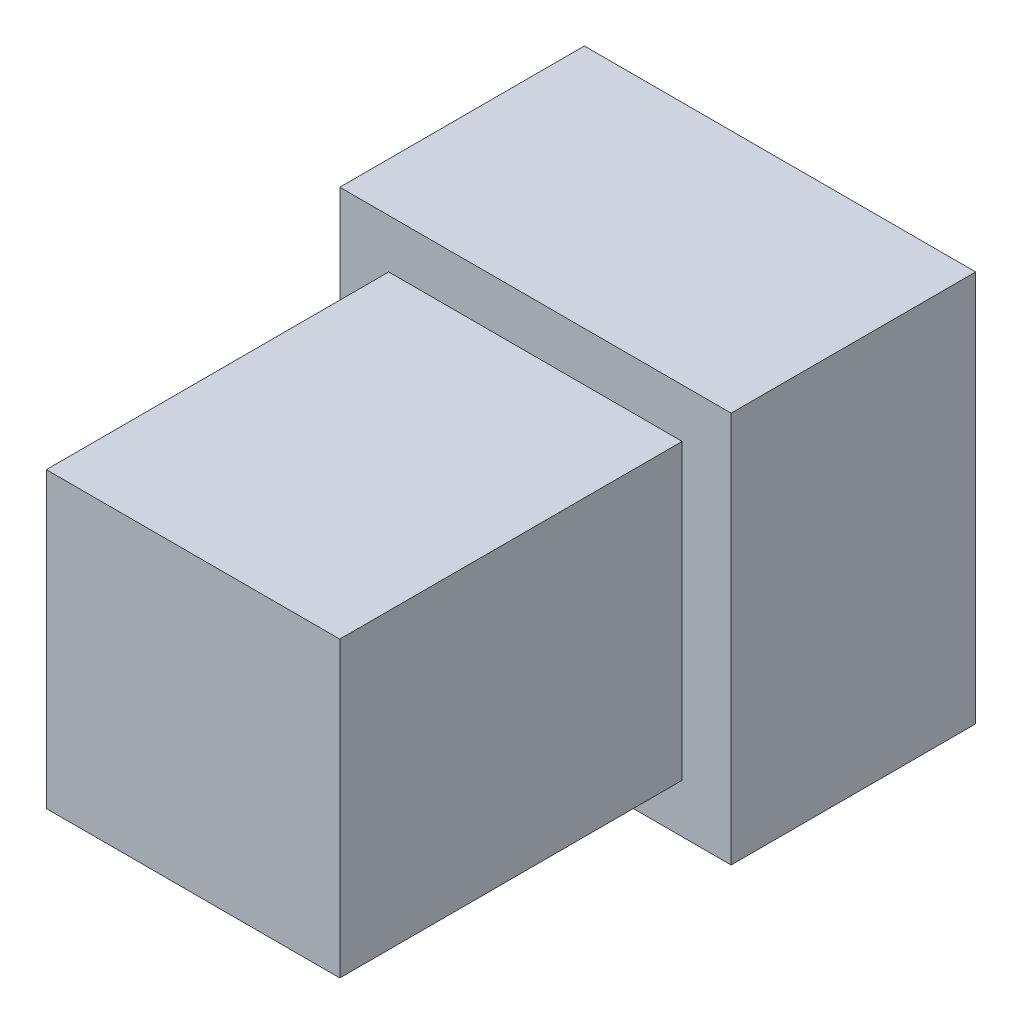
ISO-10303-21;
HEADER;
FILE_DESCRIPTION(('STEP AP214'),'2;1');
FILE_NAME('part.step','',(''),(''),'','','');
FILE_SCHEMA(('AUTOMOTIVE_DESIGN { 1 0 10303 214 1 1 1 1 }'));
ENDSEC;
DATA;
#1=APPLICATION_CONTEXT('core data for automotive mechanical design processes');
#2=APPLICATION_PROTOCOL_DEFINITION('international standard','automotive_design',2000,#1);
#3=PRODUCT_CONTEXT('',#1,'mechanical');
#4=PRODUCT('Part','Part','',(#3));
#5=PRODUCT_RELATED_PRODUCT_CATEGORY('part','',(#4));
#6=PRODUCT_DEFINITION_FORMATION('','',#4);
#7=PRODUCT_DEFINITION_CONTEXT('part definition',#1,'design');
#8=PRODUCT_DEFINITION('design','',#6,#7);
#9=PRODUCT_DEFINITION_SHAPE('','',#8);
#10=(LENGTH_UNIT() NAMED_UNIT(*) SI_UNIT(.MILLI.,.METRE.));
#11=(NAMED_UNIT(*) PLANE_ANGLE_UNIT() SI_UNIT($,.RADIAN.));
#12=(NAMED_UNIT(*) SI_UNIT($,.STERADIAN.) SOLID_ANGLE_UNIT());
#13=UNCERTAINTY_MEASURE_WITH_UNIT(LENGTH_MEASURE(1.E-05),#10,'distance_accuracy_value','');
#14=(GEOMETRIC_REPRESENTATION_CONTEXT(3) GLOBAL_UNCERTAINTY_ASSIGNED_CONTEXT((#13)) GLOBAL_UNIT_ASSIGNED_CONTEXT((#10,
#11,#12)) REPRESENTATION_CONTEXT('',''));
#15=CARTESIAN_POINT('',(0.,0.,0.));
#16=DIRECTION('',(0.,0.,1.));
#17=DIRECTION('',(1.,0.,0.));
#18=AXIS2_PLACEMENT_3D('',#15,#16,#17);
#19=CARTESIAN_POINT('',(0.,0.,5.));
#20=DIRECTION('',(0.,0.,-1.));
#21=DIRECTION('',(-1.,0.,0.));
#22=AXIS2_PLACEMENT_3D('',#19,#20,#21);
#23=PLANE('',#22);
#24=DIRECTION('',(0.,1.,0.));
#25=VECTOR('',#24,1.);
#26=CARTESIAN_POINT('',(4.,-4.,5.));
#27=LINE('',#26,#25);
#28=CARTESIAN_POINT('',(4.,-4.,5.));
#29=VERTEX_POINT('',#28);
#30=CARTESIAN_POINT('',(4.,4.,5.));
#31=VERTEX_POINT('',#30);
#32=EDGE_CURVE('E127',#29,#31,#27,.T.);
#33=ORIENTED_EDGE('',*,*,#32,.T.);
#34=DIRECTION('',(-1.,0.,0.));
#35=VECTOR('',#34,1.);
#36=CARTESIAN_POINT('',(-4.,4.,5.));
#37=LINE('',#36,#35);
#38=CARTESIAN_POINT('',(-4.,4.,5.));
#39=VERTEX_POINT('',#38);
#40=EDGE_CURVE('E130',#31,#39,#37,.T.);
#41=ORIENTED_EDGE('',*,*,#40,.T.);
#42=DIRECTION('',(0.,-1.,0.));
#43=VECTOR('',#42,1.);
#44=CARTESIAN_POINT('',(-4.,-4.,5.));
#45=LINE('',#44,#43);
#46=CARTESIAN_POINT('',(-4.,-4.,5.));
#47=VERTEX_POINT('',#46);
#48=EDGE_CURVE('E133',#39,#47,#45,.T.);
#49=ORIENTED_EDGE('',*,*,#48,.T.);
#50=DIRECTION('',(1.,0.,0.));
#51=VECTOR('',#50,1.);
#52=CARTESIAN_POINT('',(-4.,-4.,5.));
#53=LINE('',#52,#51);
#54=EDGE_CURVE('E135',#47,#29,#53,.T.);
#55=ORIENTED_EDGE('',*,*,#54,.T.);
#56=EDGE_LOOP('',(#33,#41,#49,#55));
#57=FACE_BOUND('',#56,.T.);
#58=DIRECTION('',(0.,1.,0.));
#59=VECTOR('',#58,1.);
#60=CARTESIAN_POINT('',(3.,-3.,5.));
#61=LINE('',#60,#59);
#62=CARTESIAN_POINT('',(3.,-3.,5.));
#63=VERTEX_POINT('',#62);
#64=CARTESIAN_POINT('',(3.,3.,5.));
#65=VERTEX_POINT('',#64);
#66=EDGE_CURVE('E48',#63,#65,#61,.T.);
#67=ORIENTED_EDGE('',*,*,#66,.F.);
#68=DIRECTION('',(1.,0.,0.));
#69=VECTOR('',#68,1.);
#70=CARTESIAN_POINT('',(-3.,-3.,5.));
#71=LINE('',#70,#69);
#72=CARTESIAN_POINT('',(-3.,-3.,5.));
#73=VERTEX_POINT('',#72);
#74=EDGE_CURVE('E52',#73,#63,#71,.T.);
#75=ORIENTED_EDGE('',*,*,#74,.F.);
#76=DIRECTION('',(0.,-1.,0.));
#77=VECTOR('',#76,1.);
#78=CARTESIAN_POINT('',(-3.,-3.,5.));
#79=LINE('',#78,#77);
#80=CARTESIAN_POINT('',(-3.,3.,5.));
#81=VERTEX_POINT('',#80);
#82=EDGE_CURVE('E260',#81,#73,#79,.T.);
#83=ORIENTED_EDGE('',*,*,#82,.F.);
#84=DIRECTION('',(-1.,0.,0.));
#85=VECTOR('',#84,1.);
#86=CARTESIAN_POINT('',(-3.,3.,5.));
#87=LINE('',#86,#85);
#88=EDGE_CURVE('E266',#65,#81,#87,.T.);
#89=ORIENTED_EDGE('',*,*,#88,.F.);
#90=EDGE_LOOP('',(#67,#75,#83,#89));
#91=FACE_BOUND('',#90,.T.);
#92=ADVANCED_FACE('F33',(#57,#91),#23,.F.);
#93=CARTESIAN_POINT('',(4.,-4.,5.));
#94=DIRECTION('',(-1.,0.,0.));
#95=DIRECTION('',(0.,0.,1.));
#96=AXIS2_PLACEMENT_3D('',#93,#94,#95);
#97=PLANE('',#96);
#98=DIRECTION('',(0.,1.,0.));
#99=VECTOR('',#98,1.);
#100=CARTESIAN_POINT('',(4.,-4.,0.));
#101=LINE('',#100,#99);
#102=CARTESIAN_POINT('',(4.,-4.,0.));
#103=VERTEX_POINT('',#102);
#104=CARTESIAN_POINT('',(4.,4.,0.));
#105=VERTEX_POINT('',#104);
#106=EDGE_CURVE('E118',#103,#105,#101,.T.);
#107=ORIENTED_EDGE('',*,*,#106,.T.);
#108=DIRECTION('',(0.,0.,-1.));
#109=VECTOR('',#108,1.);
#110=CARTESIAN_POINT('',(4.,4.,5.));
#111=LINE('',#110,#109);
#112=EDGE_CURVE('E11',#31,#105,#111,.T.);
#113=ORIENTED_EDGE('',*,*,#112,.F.);
#114=ORIENTED_EDGE('',*,*,#32,.F.);
#115=DIRECTION('',(0.,0.,-1.));
#116=VECTOR('',#115,1.);
#117=CARTESIAN_POINT('',(4.,-4.,5.));
#118=LINE('',#117,#116);
#119=EDGE_CURVE('E136',#29,#103,#118,.T.);
#120=ORIENTED_EDGE('',*,*,#119,.T.);
#121=EDGE_LOOP('',(#107,#113,#114,#120));
#122=FACE_BOUND('',#121,.T.);
#123=ADVANCED_FACE('F35',(#122),#97,.F.);
#124=CARTESIAN_POINT('',(-4.,4.,5.));
#125=DIRECTION('',(0.,-1.,0.));
#126=DIRECTION('',(0.,0.,-1.));
#127=AXIS2_PLACEMENT_3D('',#124,#125,#126);
#128=PLANE('',#127);
#129=DIRECTION('',(-1.,0.,0.));
#130=VECTOR('',#129,1.);
#131=CARTESIAN_POINT('',(-4.,4.,0.));
#132=LINE('',#131,#130);
#133=CARTESIAN_POINT('',(-4.,4.,0.));
#134=VERTEX_POINT('',#133);
#135=EDGE_CURVE('E121',#105,#134,#132,.T.);
#136=ORIENTED_EDGE('',*,*,#135,.T.);
#137=DIRECTION('',(0.,0.,-1.));
#138=VECTOR('',#137,1.);
#139=CARTESIAN_POINT('',(-4.,4.,5.));
#140=LINE('',#139,#138);
#141=EDGE_CURVE('E41',#39,#134,#140,.T.);
#142=ORIENTED_EDGE('',*,*,#141,.F.);
#143=ORIENTED_EDGE('',*,*,#40,.F.);
#144=ORIENTED_EDGE('',*,*,#112,.T.);
#145=EDGE_LOOP('',(#136,#142,#143,#144));
#146=FACE_BOUND('',#145,.T.);
#147=ADVANCED_FACE('F166',(#146),#128,.F.);
#148=CARTESIAN_POINT('',(-4.,-4.,5.));
#149=DIRECTION('',(1.,0.,0.));
#150=DIRECTION('',(0.,0.,-1.));
#151=AXIS2_PLACEMENT_3D('',#148,#149,#150);
#152=PLANE('',#151);
#153=DIRECTION('',(0.,-1.,0.));
#154=VECTOR('',#153,1.);
#155=CARTESIAN_POINT('',(-4.,-4.,0.));
#156=LINE('',#155,#154);
#157=CARTESIAN_POINT('',(-4.,-4.,0.));
#158=VERTEX_POINT('',#157);
#159=EDGE_CURVE('E139',#134,#158,#156,.T.);
#160=ORIENTED_EDGE('',*,*,#159,.T.);
#161=DIRECTION('',(0.,0.,-1.));
#162=VECTOR('',#161,1.);
#163=CARTESIAN_POINT('',(-4.,-4.,5.));
#164=LINE('',#163,#162);
#165=EDGE_CURVE('E144',#47,#158,#164,.T.);
#166=ORIENTED_EDGE('',*,*,#165,.F.);
#167=ORIENTED_EDGE('',*,*,#48,.F.);
#168=ORIENTED_EDGE('',*,*,#141,.T.);
#169=EDGE_LOOP('',(#160,#166,#167,#168));
#170=FACE_BOUND('',#169,.T.);
#171=ADVANCED_FACE('F151',(#170),#152,.F.);
#172=CARTESIAN_POINT('',(-4.,-4.,5.));
#173=DIRECTION('',(0.,1.,0.));
#174=DIRECTION('',(0.,0.,1.));
#175=AXIS2_PLACEMENT_3D('',#172,#173,#174);
#176=PLANE('',#175);
#177=DIRECTION('',(1.,0.,0.));
#178=VECTOR('',#177,1.);
#179=CARTESIAN_POINT('',(-4.,-4.,0.));
#180=LINE('',#179,#178);
#181=EDGE_CURVE('E131',#158,#103,#180,.T.);
#182=ORIENTED_EDGE('',*,*,#181,.T.);
#183=ORIENTED_EDGE('',*,*,#119,.F.);
#184=ORIENTED_EDGE('',*,*,#54,.F.);
#185=ORIENTED_EDGE('',*,*,#165,.T.);
#186=EDGE_LOOP('',(#182,#183,#184,#185));
#187=FACE_BOUND('',#186,.T.);
#188=ADVANCED_FACE('F160',(#187),#176,.F.);
#189=CARTESIAN_POINT('',(0.,0.,0.));
#190=DIRECTION('',(0.,0.,-1.));
#191=DIRECTION('',(-1.,0.,0.));
#192=AXIS2_PLACEMENT_3D('',#189,#190,#191);
#193=PLANE('',#192);
#194=ORIENTED_EDGE('',*,*,#106,.F.);
#195=ORIENTED_EDGE('',*,*,#181,.F.);
#196=ORIENTED_EDGE('',*,*,#159,.F.);
#197=ORIENTED_EDGE('',*,*,#135,.F.);
#198=EDGE_LOOP('',(#194,#195,#196,#197));
#199=FACE_BOUND('',#198,.T.);
#200=ADVANCED_FACE('F157',(#199),#193,.T.);
#201=CARTESIAN_POINT('',(3.,-3.,12.));
#202=DIRECTION('',(-1.,0.,0.));
#203=DIRECTION('',(0.,0.,1.));
#204=AXIS2_PLACEMENT_3D('',#201,#202,#203);
#205=PLANE('',#204);
#206=ORIENTED_EDGE('',*,*,#66,.T.);
#207=DIRECTION('',(0.,0.,-1.));
#208=VECTOR('',#207,1.);
#209=CARTESIAN_POINT('',(3.,3.,12.));
#210=LINE('',#209,#208);
#211=CARTESIAN_POINT('',(3.,3.,12.));
#212=VERTEX_POINT('',#211);
#213=EDGE_CURVE('E101',#212,#65,#210,.T.);
#214=ORIENTED_EDGE('',*,*,#213,.F.);
#215=DIRECTION('',(0.,1.,0.));
#216=VECTOR('',#215,1.);
#217=CARTESIAN_POINT('',(3.,-3.,12.));
#218=LINE('',#217,#216);
#219=CARTESIAN_POINT('',(3.,-3.,12.));
#220=VERTEX_POINT('',#219);
#221=EDGE_CURVE('E107',#220,#212,#218,.T.);
#222=ORIENTED_EDGE('',*,*,#221,.F.);
#223=DIRECTION('',(0.,0.,-1.));
#224=VECTOR('',#223,1.);
#225=CARTESIAN_POINT('',(3.,-3.,12.));
#226=LINE('',#225,#224);
#227=EDGE_CURVE('E258',#220,#63,#226,.T.);
#228=ORIENTED_EDGE('',*,*,#227,.T.);
#229=EDGE_LOOP('',(#206,#214,#222,#228));
#230=FACE_BOUND('',#229,.T.);
#231=ADVANCED_FACE('F117',(#230),#205,.F.);
#232=CARTESIAN_POINT('',(-3.,3.,12.));
#233=DIRECTION('',(0.,-1.,0.));
#234=DIRECTION('',(0.,0.,-1.));
#235=AXIS2_PLACEMENT_3D('',#232,#233,#234);
#236=PLANE('',#235);
#237=ORIENTED_EDGE('',*,*,#88,.T.);
#238=DIRECTION('',(0.,0.,-1.));
#239=VECTOR('',#238,1.);
#240=CARTESIAN_POINT('',(-3.,3.,12.));
#241=LINE('',#240,#239);
#242=CARTESIAN_POINT('',(-3.,3.,12.));
#243=VERTEX_POINT('',#242);
#244=EDGE_CURVE('E103',#243,#81,#241,.T.);
#245=ORIENTED_EDGE('',*,*,#244,.F.);
#246=DIRECTION('',(-1.,0.,0.));
#247=VECTOR('',#246,1.);
#248=CARTESIAN_POINT('',(-3.,3.,12.));
#249=LINE('',#248,#247);
#250=EDGE_CURVE('E96',#212,#243,#249,.T.);
#251=ORIENTED_EDGE('',*,*,#250,.F.);
#252=ORIENTED_EDGE('',*,*,#213,.T.);
#253=EDGE_LOOP('',(#237,#245,#251,#252));
#254=FACE_BOUND('',#253,.T.);
#255=ADVANCED_FACE('F99',(#254),#236,.F.);
#256=CARTESIAN_POINT('',(-3.,-3.,12.));
#257=DIRECTION('',(1.,0.,0.));
#258=DIRECTION('',(0.,0.,-1.));
#259=AXIS2_PLACEMENT_3D('',#256,#257,#258);
#260=PLANE('',#259);
#261=ORIENTED_EDGE('',*,*,#82,.T.);
#262=DIRECTION('',(0.,0.,-1.));
#263=VECTOR('',#262,1.);
#264=CARTESIAN_POINT('',(-3.,-3.,12.));
#265=LINE('',#264,#263);
#266=CARTESIAN_POINT('',(-3.,-3.,12.));
#267=VERTEX_POINT('',#266);
#268=EDGE_CURVE('E123',#267,#73,#265,.T.);
#269=ORIENTED_EDGE('',*,*,#268,.F.);
#270=DIRECTION('',(0.,-1.,0.));
#271=VECTOR('',#270,1.);
#272=CARTESIAN_POINT('',(-3.,-3.,12.));
#273=LINE('',#272,#271);
#274=EDGE_CURVE('E106',#243,#267,#273,.T.);
#275=ORIENTED_EDGE('',*,*,#274,.F.);
#276=ORIENTED_EDGE('',*,*,#244,.T.);
#277=EDGE_LOOP('',(#261,#269,#275,#276));
#278=FACE_BOUND('',#277,.T.);
#279=ADVANCED_FACE('F202',(#278),#260,.F.);
#280=CARTESIAN_POINT('',(-3.,-3.,12.));
#281=DIRECTION('',(0.,1.,0.));
#282=DIRECTION('',(0.,0.,1.));
#283=AXIS2_PLACEMENT_3D('',#280,#281,#282);
#284=PLANE('',#283);
#285=ORIENTED_EDGE('',*,*,#74,.T.);
#286=ORIENTED_EDGE('',*,*,#227,.F.);
#287=DIRECTION('',(1.,0.,0.));
#288=VECTOR('',#287,1.);
#289=CARTESIAN_POINT('',(-3.,-3.,12.));
#290=LINE('',#289,#288);
#291=EDGE_CURVE('E112',#267,#220,#290,.T.);
#292=ORIENTED_EDGE('',*,*,#291,.F.);
#293=ORIENTED_EDGE('',*,*,#268,.T.);
#294=EDGE_LOOP('',(#285,#286,#292,#293));
#295=FACE_BOUND('',#294,.T.);
#296=ADVANCED_FACE('F208',(#295),#284,.F.);
#297=CARTESIAN_POINT('',(0.,0.,12.));
#298=DIRECTION('',(0.,0.,-1.));
#299=DIRECTION('',(-1.,0.,0.));
#300=AXIS2_PLACEMENT_3D('',#297,#298,#299);
#301=PLANE('',#300);
#302=ORIENTED_EDGE('',*,*,#221,.T.);
#303=ORIENTED_EDGE('',*,*,#250,.T.);
#304=ORIENTED_EDGE('',*,*,#274,.T.);
#305=ORIENTED_EDGE('',*,*,#291,.T.);
#306=EDGE_LOOP('',(#302,#303,#304,#305));
#307=FACE_BOUND('',#306,.T.);
#308=ADVANCED_FACE('F110',(#307),#301,.F.);
#309=CLOSED_SHELL('',(#92,#123,#147,#171,#188,#200,#231,#255,#279,#296,#308));
#310=MANIFOLD_SOLID_BREP('B2',#309);
#311=ADVANCED_BREP_SHAPE_REPRESENTATION('',(#18,#310),#14);
#312=SHAPE_DEFINITION_REPRESENTATION(#9,#311);
ENDSEC;
END-ISO-10303-21;
